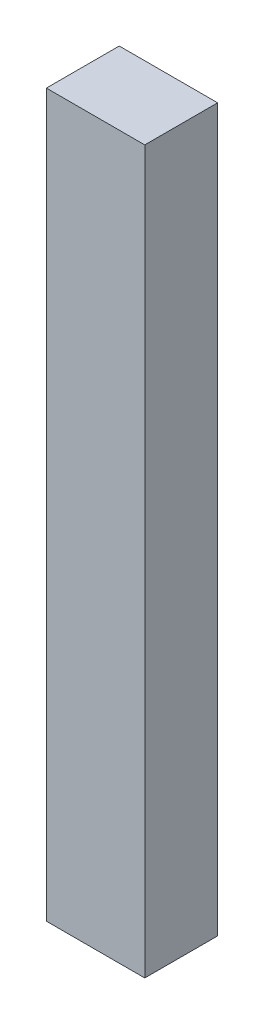
ISO-10303-21;
HEADER;
FILE_DESCRIPTION(('STEP AP214'),'2;1');
FILE_NAME('part.step','',(''),(''),'','','');
FILE_SCHEMA(('AUTOMOTIVE_DESIGN { 1 0 10303 214 1 1 1 1 }'));
ENDSEC;
DATA;
#1=APPLICATION_CONTEXT('core data for automotive mechanical design processes');
#2=APPLICATION_PROTOCOL_DEFINITION('international standard','automotive_design',2000,#1);
#3=PRODUCT_CONTEXT('',#1,'mechanical');
#4=PRODUCT('Part','Part','',(#3));
#5=PRODUCT_RELATED_PRODUCT_CATEGORY('part','',(#4));
#6=PRODUCT_DEFINITION_FORMATION('','',#4);
#7=PRODUCT_DEFINITION_CONTEXT('part definition',#1,'design');
#8=PRODUCT_DEFINITION('design','',#6,#7);
#9=PRODUCT_DEFINITION_SHAPE('','',#8);
#10=(LENGTH_UNIT() NAMED_UNIT(*) SI_UNIT(.MILLI.,.METRE.));
#11=(NAMED_UNIT(*) PLANE_ANGLE_UNIT() SI_UNIT($,.RADIAN.));
#12=(NAMED_UNIT(*) SI_UNIT($,.STERADIAN.) SOLID_ANGLE_UNIT());
#13=UNCERTAINTY_MEASURE_WITH_UNIT(LENGTH_MEASURE(1.E-05),#10,'distance_accuracy_value','');
#14=(GEOMETRIC_REPRESENTATION_CONTEXT(3) GLOBAL_UNCERTAINTY_ASSIGNED_CONTEXT((#13)) GLOBAL_UNIT_ASSIGNED_CONTEXT((#10,
#11,#12)) REPRESENTATION_CONTEXT('',''));
#15=CARTESIAN_POINT('',(0.,0.,0.));
#16=DIRECTION('',(0.,0.,1.));
#17=DIRECTION('',(1.,0.,0.));
#18=AXIS2_PLACEMENT_3D('',#15,#16,#17);
#19=CARTESIAN_POINT('',(0.67499992,-4.95000026,0.));
#20=DIRECTION('',(-1.,0.,0.));
#21=DIRECTION('',(0.,1.,0.));
#22=AXIS2_PLACEMENT_3D('',#19,#20,#21);
#23=PLANE('',#22);
#24=DIRECTION('',(0.,1.,0.));
#25=VECTOR('',#24,1.);
#26=CARTESIAN_POINT('',(0.67499992,-4.95000026,0.));
#27=LINE('',#26,#25);
#28=CARTESIAN_POINT('',(0.67499992,-4.95000026,0.));
#29=VERTEX_POINT('',#28);
#30=CARTESIAN_POINT('',(0.67499992,4.95000026,0.));
#31=VERTEX_POINT('',#30);
#32=EDGE_CURVE('E11',#29,#31,#27,.T.);
#33=ORIENTED_EDGE('',*,*,#32,.T.);
#34=DIRECTION('',(0.,0.,1.));
#35=VECTOR('',#34,1.);
#36=CARTESIAN_POINT('',(0.67499992,4.95000026,0.));
#37=LINE('',#36,#35);
#38=CARTESIAN_POINT('',(0.67499992,4.95000026,1.00000054));
#39=VERTEX_POINT('',#38);
#40=EDGE_CURVE('E24',#31,#39,#37,.T.);
#41=ORIENTED_EDGE('',*,*,#40,.T.);
#42=DIRECTION('',(0.,1.,0.));
#43=VECTOR('',#42,1.);
#44=CARTESIAN_POINT('',(0.67499992,-4.95000026,1.00000054));
#45=LINE('',#44,#43);
#46=CARTESIAN_POINT('',(0.67499992,-4.95000026,1.00000054));
#47=VERTEX_POINT('',#46);
#48=EDGE_CURVE('E87',#47,#39,#45,.T.);
#49=ORIENTED_EDGE('',*,*,#48,.F.);
#50=DIRECTION('',(0.,0.,1.));
#51=VECTOR('',#50,1.);
#52=CARTESIAN_POINT('',(0.67499992,-4.95000026,0.));
#53=LINE('',#52,#51);
#54=EDGE_CURVE('E36',#29,#47,#53,.T.);
#55=ORIENTED_EDGE('',*,*,#54,.F.);
#56=EDGE_LOOP('',(#33,#41,#49,#55));
#57=FACE_BOUND('',#56,.T.);
#58=ADVANCED_FACE('F17',(#57),#23,.F.);
#59=CARTESIAN_POINT('',(0.67499992,4.95000026,0.));
#60=DIRECTION('',(0.,-1.,0.));
#61=DIRECTION('',(-1.,0.,0.));
#62=AXIS2_PLACEMENT_3D('',#59,#60,#61);
#63=PLANE('',#62);
#64=DIRECTION('',(-1.,0.,0.));
#65=VECTOR('',#64,1.);
#66=CARTESIAN_POINT('',(0.67499992,4.95000026,0.));
#67=LINE('',#66,#65);
#68=CARTESIAN_POINT('',(-0.67499992,4.95000026,0.));
#69=VERTEX_POINT('',#68);
#70=EDGE_CURVE('E84',#31,#69,#67,.T.);
#71=ORIENTED_EDGE('',*,*,#70,.T.);
#72=DIRECTION('',(0.,0.,1.));
#73=VECTOR('',#72,1.);
#74=CARTESIAN_POINT('',(-0.67499992,4.95000026,0.));
#75=LINE('',#74,#73);
#76=CARTESIAN_POINT('',(-0.67499992,4.95000026,1.00000054));
#77=VERTEX_POINT('',#76);
#78=EDGE_CURVE('E82',#69,#77,#75,.T.);
#79=ORIENTED_EDGE('',*,*,#78,.T.);
#80=DIRECTION('',(-1.,0.,0.));
#81=VECTOR('',#80,1.);
#82=CARTESIAN_POINT('',(0.67499992,4.95000026,1.00000054));
#83=LINE('',#82,#81);
#84=EDGE_CURVE('E62',#39,#77,#83,.T.);
#85=ORIENTED_EDGE('',*,*,#84,.F.);
#86=ORIENTED_EDGE('',*,*,#40,.F.);
#87=EDGE_LOOP('',(#71,#79,#85,#86));
#88=FACE_BOUND('',#87,.T.);
#89=ADVANCED_FACE('F89',(#88),#63,.F.);
#90=CARTESIAN_POINT('',(-0.67499992,4.95000026,0.));
#91=DIRECTION('',(1.,0.,0.));
#92=DIRECTION('',(0.,-1.,0.));
#93=AXIS2_PLACEMENT_3D('',#90,#91,#92);
#94=PLANE('',#93);
#95=DIRECTION('',(0.,-1.,0.));
#96=VECTOR('',#95,1.);
#97=CARTESIAN_POINT('',(-0.67499992,4.95000026,0.));
#98=LINE('',#97,#96);
#99=CARTESIAN_POINT('',(-0.67499992,-4.95000026,0.));
#100=VERTEX_POINT('',#99);
#101=EDGE_CURVE('E71',#69,#100,#98,.T.);
#102=ORIENTED_EDGE('',*,*,#101,.T.);
#103=DIRECTION('',(0.,0.,1.));
#104=VECTOR('',#103,1.);
#105=CARTESIAN_POINT('',(-0.67499992,-4.95000026,0.));
#106=LINE('',#105,#104);
#107=CARTESIAN_POINT('',(-0.67499992,-4.95000026,1.00000054));
#108=VERTEX_POINT('',#107);
#109=EDGE_CURVE('E65',#100,#108,#106,.T.);
#110=ORIENTED_EDGE('',*,*,#109,.T.);
#111=DIRECTION('',(0.,-1.,0.));
#112=VECTOR('',#111,1.);
#113=CARTESIAN_POINT('',(-0.67499992,4.95000026,1.00000054));
#114=LINE('',#113,#112);
#115=EDGE_CURVE('E57',#77,#108,#114,.T.);
#116=ORIENTED_EDGE('',*,*,#115,.F.);
#117=ORIENTED_EDGE('',*,*,#78,.F.);
#118=EDGE_LOOP('',(#102,#110,#116,#117));
#119=FACE_BOUND('',#118,.T.);
#120=ADVANCED_FACE('F69',(#119),#94,.F.);
#121=CARTESIAN_POINT('',(-0.67499992,-4.95000026,0.));
#122=DIRECTION('',(0.,1.,0.));
#123=DIRECTION('',(1.,0.,0.));
#124=AXIS2_PLACEMENT_3D('',#121,#122,#123);
#125=PLANE('',#124);
#126=DIRECTION('',(1.,0.,0.));
#127=VECTOR('',#126,1.);
#128=CARTESIAN_POINT('',(-0.67499992,-4.95000026,0.));
#129=LINE('',#128,#127);
#130=EDGE_CURVE('E66',#100,#29,#129,.T.);
#131=ORIENTED_EDGE('',*,*,#130,.T.);
#132=ORIENTED_EDGE('',*,*,#54,.T.);
#133=DIRECTION('',(1.,0.,0.));
#134=VECTOR('',#133,1.);
#135=CARTESIAN_POINT('',(-0.67499992,-4.95000026,1.00000054));
#136=LINE('',#135,#134);
#137=EDGE_CURVE('E61',#108,#47,#136,.T.);
#138=ORIENTED_EDGE('',*,*,#137,.F.);
#139=ORIENTED_EDGE('',*,*,#109,.F.);
#140=EDGE_LOOP('',(#131,#132,#138,#139));
#141=FACE_BOUND('',#140,.T.);
#142=ADVANCED_FACE('F76',(#141),#125,.F.);
#143=CARTESIAN_POINT('',(0.,0.,0.));
#144=DIRECTION('',(0.,0.,1.));
#145=DIRECTION('',(1.,0.,0.));
#146=AXIS2_PLACEMENT_3D('',#143,#144,#145);
#147=PLANE('',#146);
#148=ORIENTED_EDGE('',*,*,#130,.F.);
#149=ORIENTED_EDGE('',*,*,#101,.F.);
#150=ORIENTED_EDGE('',*,*,#70,.F.);
#151=ORIENTED_EDGE('',*,*,#32,.F.);
#152=EDGE_LOOP('',(#148,#149,#150,#151));
#153=FACE_BOUND('',#152,.T.);
#154=ADVANCED_FACE('F91',(#153),#147,.F.);
#155=CARTESIAN_POINT('',(0.,0.,1.00000054));
#156=DIRECTION('',(0.,0.,1.));
#157=DIRECTION('',(1.,0.,0.));
#158=AXIS2_PLACEMENT_3D('',#155,#156,#157);
#159=PLANE('',#158);
#160=ORIENTED_EDGE('',*,*,#48,.T.);
#161=ORIENTED_EDGE('',*,*,#84,.T.);
#162=ORIENTED_EDGE('',*,*,#115,.T.);
#163=ORIENTED_EDGE('',*,*,#137,.T.);
#164=EDGE_LOOP('',(#160,#161,#162,#163));
#165=FACE_BOUND('',#164,.T.);
#166=ADVANCED_FACE('F59',(#165),#159,.T.);
#167=CLOSED_SHELL('',(#58,#89,#120,#142,#154,#166));
#168=MANIFOLD_SOLID_BREP('B1',#167);
#169=ADVANCED_BREP_SHAPE_REPRESENTATION('',(#18,#168),#14);
#170=SHAPE_DEFINITION_REPRESENTATION(#9,#169);
ENDSEC;
END-ISO-10303-21;
